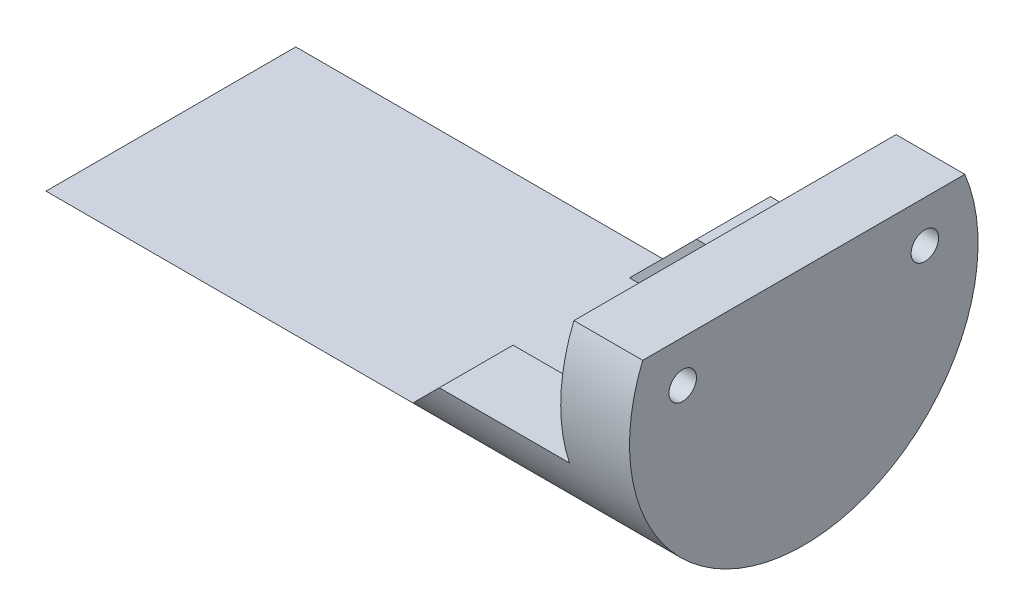
ISO-10303-21;
HEADER;
FILE_DESCRIPTION(('STEP AP214'),'2;1');
FILE_NAME('part.step','',(''),(''),'','','');
FILE_SCHEMA(('AUTOMOTIVE_DESIGN { 1 0 10303 214 1 1 1 1 }'));
ENDSEC;
DATA;
#1=APPLICATION_CONTEXT('core data for automotive mechanical design processes');
#2=APPLICATION_PROTOCOL_DEFINITION('international standard','automotive_design',2000,#1);
#3=PRODUCT_CONTEXT('',#1,'mechanical');
#4=PRODUCT('Part','Part','',(#3));
#5=PRODUCT_RELATED_PRODUCT_CATEGORY('part','',(#4));
#6=PRODUCT_DEFINITION_FORMATION('','',#4);
#7=PRODUCT_DEFINITION_CONTEXT('part definition',#1,'design');
#8=PRODUCT_DEFINITION('design','',#6,#7);
#9=PRODUCT_DEFINITION_SHAPE('','',#8);
#10=(LENGTH_UNIT() NAMED_UNIT(*) SI_UNIT(.MILLI.,.METRE.));
#11=(NAMED_UNIT(*) PLANE_ANGLE_UNIT() SI_UNIT($,.RADIAN.));
#12=(NAMED_UNIT(*) SI_UNIT($,.STERADIAN.) SOLID_ANGLE_UNIT());
#13=UNCERTAINTY_MEASURE_WITH_UNIT(LENGTH_MEASURE(1.E-05),#10,'distance_accuracy_value','');
#14=(GEOMETRIC_REPRESENTATION_CONTEXT(3) GLOBAL_UNCERTAINTY_ASSIGNED_CONTEXT((#13)) GLOBAL_UNIT_ASSIGNED_CONTEXT((#10,
#11,#12)) REPRESENTATION_CONTEXT('',''));
#15=CARTESIAN_POINT('',(0.,0.,0.));
#16=DIRECTION('',(0.,0.,1.));
#17=DIRECTION('',(1.,0.,0.));
#18=AXIS2_PLACEMENT_3D('',#15,#16,#17);
#19=CARTESIAN_POINT('',(0.,2.7,-13.2));
#20=DIRECTION('',(1.,0.,0.));
#21=DIRECTION('',(0.,0.,-1.));
#22=AXIS2_PLACEMENT_3D('',#19,#20,#21);
#23=CYLINDRICAL_SURFACE('',#22,0.75);
#24=CARTESIAN_POINT('',(61.5,2.7,-13.2));
#25=DIRECTION('',(1.,0.,0.));
#26=DIRECTION('',(0.,0.,-1.));
#27=AXIS2_PLACEMENT_3D('',#24,#25,#26);
#28=CIRCLE('',#27,0.75);
#29=CARTESIAN_POINT('',(61.5,2.7,-13.95));
#30=VERTEX_POINT('',#29);
#31=EDGE_CURVE('E232',#30,#30,#28,.T.);
#32=ORIENTED_EDGE('',*,*,#31,.F.);
#33=EDGE_LOOP('',(#32));
#34=FACE_BOUND('',#33,.T.);
#35=CARTESIAN_POINT('',(62.5,2.7,-13.2));
#36=DIRECTION('',(1.,0.,0.));
#37=DIRECTION('',(0.,0.,-1.));
#38=AXIS2_PLACEMENT_3D('',#35,#36,#37);
#39=CIRCLE('',#38,0.75);
#40=CARTESIAN_POINT('',(62.5,2.7,-13.95));
#41=VERTEX_POINT('',#40);
#42=EDGE_CURVE('E42',#41,#41,#39,.F.);
#43=ORIENTED_EDGE('',*,*,#42,.F.);
#44=EDGE_LOOP('',(#43));
#45=FACE_BOUND('',#44,.T.);
#46=ADVANCED_FACE('F38',(#34,#45),#23,.F.);
#47=CARTESIAN_POINT('',(0.,2.7,13.2));
#48=DIRECTION('',(1.,0.,0.));
#49=DIRECTION('',(0.,0.,-1.));
#50=AXIS2_PLACEMENT_3D('',#47,#48,#49);
#51=CYLINDRICAL_SURFACE('',#50,0.75);
#52=CARTESIAN_POINT('',(61.5,2.7,13.2));
#53=DIRECTION('',(1.,0.,0.));
#54=DIRECTION('',(0.,0.,-1.));
#55=AXIS2_PLACEMENT_3D('',#52,#53,#54);
#56=CIRCLE('',#55,0.75);
#57=CARTESIAN_POINT('',(61.5,2.7,12.45));
#58=VERTEX_POINT('',#57);
#59=EDGE_CURVE('E163',#58,#58,#56,.T.);
#60=ORIENTED_EDGE('',*,*,#59,.F.);
#61=EDGE_LOOP('',(#60));
#62=FACE_BOUND('',#61,.T.);
#63=CARTESIAN_POINT('',(62.5,2.7,13.2));
#64=DIRECTION('',(1.,0.,0.));
#65=DIRECTION('',(0.,0.,-1.));
#66=AXIS2_PLACEMENT_3D('',#63,#64,#65);
#67=CIRCLE('',#66,0.75);
#68=CARTESIAN_POINT('',(62.5,2.7,12.45));
#69=VERTEX_POINT('',#68);
#70=EDGE_CURVE('E226',#69,#69,#67,.F.);
#71=ORIENTED_EDGE('',*,*,#70,.F.);
#72=EDGE_LOOP('',(#71));
#73=FACE_BOUND('',#72,.T.);
#74=ADVANCED_FACE('F254',(#62,#73),#51,.F.);
#75=CARTESIAN_POINT('',(61.5,7.25000000000004,-19.));
#76=DIRECTION('',(1.,0.,0.));
#77=DIRECTION('',(0.,0.,-1.));
#78=AXIS2_PLACEMENT_3D('',#75,#76,#77);
#79=PLANE('',#78);
#80=ORIENTED_EDGE('',*,*,#59,.T.);
#81=EDGE_LOOP('',(#80));
#82=FACE_BOUND('',#81,.T.);
#83=ORIENTED_EDGE('',*,*,#31,.T.);
#84=EDGE_LOOP('',(#83));
#85=FACE_BOUND('',#84,.T.);
#86=DIRECTION('',(0.,1.,0.));
#87=VECTOR('',#86,1.);
#88=CARTESIAN_POINT('',(61.5,-13.2500000000001,-10.));
#89=LINE('',#88,#87);
#90=CARTESIAN_POINT('',(61.5,-5.94469584126148,-10.));
#91=VERTEX_POINT('',#90);
#92=CARTESIAN_POINT('',(61.5,5.78142433836487,-10.));
#93=VERTEX_POINT('',#92);
#94=EDGE_CURVE('E157',#91,#93,#89,.T.);
#95=ORIENTED_EDGE('',*,*,#94,.T.);
#96=DIRECTION('',(0.,0.,1.));
#97=VECTOR('',#96,1.);
#98=CARTESIAN_POINT('',(61.5,5.78142433836487,-10.));
#99=LINE('',#98,#97);
#100=CARTESIAN_POINT('',(61.5,5.78142433836487,10.));
#101=VERTEX_POINT('',#100);
#102=EDGE_CURVE('E160',#93,#101,#99,.T.);
#103=ORIENTED_EDGE('',*,*,#102,.T.);
#104=DIRECTION('',(0.,1.,0.));
#105=VECTOR('',#104,1.);
#106=CARTESIAN_POINT('',(61.5,-13.2500000000001,10.));
#107=LINE('',#106,#105);
#108=CARTESIAN_POINT('',(61.5,-5.94469584126147,10.));
#109=VERTEX_POINT('',#108);
#110=EDGE_CURVE('E168',#109,#101,#107,.T.);
#111=ORIENTED_EDGE('',*,*,#110,.F.);
#112=DIRECTION('',(0.,0.,1.));
#113=VECTOR('',#112,1.);
#114=CARTESIAN_POINT('',(61.5,-5.94469584126148,-19.));
#115=LINE('',#114,#113);
#116=CARTESIAN_POINT('',(61.5,-5.94469584126148,18.046068584456));
#117=VERTEX_POINT('',#116);
#118=EDGE_CURVE('E189',#109,#117,#115,.T.);
#119=ORIENTED_EDGE('',*,*,#118,.T.);
#120=CARTESIAN_POINT('',(61.5,0.,0.));
#121=DIRECTION('',(1.,0.,0.));
#122=DIRECTION('',(0.,0.,-1.));
#123=AXIS2_PLACEMENT_3D('',#120,#121,#122);
#124=CIRCLE('',#123,19.);
#125=CARTESIAN_POINT('',(61.5,7.25000000000004,17.5623887896835));
#126=VERTEX_POINT('',#125);
#127=EDGE_CURVE('E217',#126,#117,#124,.T.);
#128=ORIENTED_EDGE('',*,*,#127,.F.);
#129=DIRECTION('',(0.,0.,1.));
#130=VECTOR('',#129,1.);
#131=CARTESIAN_POINT('',(61.5,7.25000000000004,-19.));
#132=LINE('',#131,#130);
#133=CARTESIAN_POINT('',(61.5,7.25000000000004,-17.5623887896835));
#134=VERTEX_POINT('',#133);
#135=EDGE_CURVE('E182',#134,#126,#132,.T.);
#136=ORIENTED_EDGE('',*,*,#135,.F.);
#137=CARTESIAN_POINT('',(61.5,-5.94469584126148,-18.046068584456));
#138=VERTEX_POINT('',#137);
#139=EDGE_CURVE('E221',#138,#134,#124,.T.);
#140=ORIENTED_EDGE('',*,*,#139,.F.);
#141=EDGE_CURVE('E186',#138,#91,#115,.T.);
#142=ORIENTED_EDGE('',*,*,#141,.T.);
#143=EDGE_LOOP('',(#95,#103,#111,#119,#128,#136,#140,#142));
#144=FACE_BOUND('',#143,.T.);
#145=ADVANCED_FACE('F252',(#82,#85,#144),#79,.F.);
#146=CARTESIAN_POINT('',(61.5,-5.94469584126148,-19.));
#147=DIRECTION('',(0.,-1.,0.));
#148=DIRECTION('',(0.,0.,-1.));
#149=AXIS2_PLACEMENT_3D('',#146,#147,#148);
#150=PLANE('',#149);
#151=DIRECTION('',(1.,0.,0.));
#152=VECTOR('',#151,1.);
#153=CARTESIAN_POINT('',(61.5,-5.94469584126148,10.));
#154=LINE('',#153,#152);
#155=CARTESIAN_POINT('',(47.3053041587385,-5.94469584126148,10.));
#156=VERTEX_POINT('',#155);
#157=EDGE_CURVE('E180',#156,#109,#154,.T.);
#158=ORIENTED_EDGE('',*,*,#157,.F.);
#159=DIRECTION('',(0.,0.,1.));
#160=VECTOR('',#159,1.);
#161=CARTESIAN_POINT('',(47.3053041587385,-5.94469584126148,-19.));
#162=LINE('',#161,#160);
#163=CARTESIAN_POINT('',(47.3053041587385,-5.94469584126148,18.046068584456));
#164=VERTEX_POINT('',#163);
#165=EDGE_CURVE('E193',#156,#164,#162,.T.);
#166=ORIENTED_EDGE('',*,*,#165,.T.);
#167=DIRECTION('',(-1.,0.,0.));
#168=VECTOR('',#167,1.);
#169=CARTESIAN_POINT('',(69.,-5.94469584126148,18.046068584456));
#170=LINE('',#169,#168);
#171=EDGE_CURVE('E220',#117,#164,#170,.T.);
#172=ORIENTED_EDGE('',*,*,#171,.F.);
#173=ORIENTED_EDGE('',*,*,#118,.F.);
#174=EDGE_LOOP('',(#158,#166,#172,#173));
#175=FACE_BOUND('',#174,.T.);
#176=ADVANCED_FACE('F262',(#175),#150,.F.);
#177=DIRECTION('',(-1.,0.,0.));
#178=VECTOR('',#177,1.);
#179=CARTESIAN_POINT('',(61.5,-5.94469584126148,-10.));
#180=LINE('',#179,#178);
#181=CARTESIAN_POINT('',(47.3053041587385,-5.94469584126148,-10.));
#182=VERTEX_POINT('',#181);
#183=EDGE_CURVE('E56',#91,#182,#180,.T.);
#184=ORIENTED_EDGE('',*,*,#183,.F.);
#185=ORIENTED_EDGE('',*,*,#141,.F.);
#186=DIRECTION('',(-1.,0.,0.));
#187=VECTOR('',#186,1.);
#188=CARTESIAN_POINT('',(69.,-5.94469584126148,-18.046068584456));
#189=LINE('',#188,#187);
#190=CARTESIAN_POINT('',(47.3053041587385,-5.94469584126148,-18.046068584456));
#191=VERTEX_POINT('',#190);
#192=EDGE_CURVE('E47',#191,#138,#189,.F.);
#193=ORIENTED_EDGE('',*,*,#192,.F.);
#194=EDGE_CURVE('E190',#191,#182,#162,.T.);
#195=ORIENTED_EDGE('',*,*,#194,.T.);
#196=EDGE_LOOP('',(#184,#185,#193,#195));
#197=FACE_BOUND('',#196,.T.);
#198=ADVANCED_FACE('F289',(#197),#150,.F.);
#199=CARTESIAN_POINT('',(47.3053041587385,-5.94469584126148,-19.));
#200=DIRECTION('',(0.70710678118655,-0.707106781186545,0.));
#201=DIRECTION('',(0.707106781186545,0.70710678118655,0.));
#202=AXIS2_PLACEMENT_3D('',#199,#200,#201);
#203=PLANE('',#202);
#204=DIRECTION('',(0.707106781186545,0.70710678118655,0.));
#205=VECTOR('',#204,1.);
#206=CARTESIAN_POINT('',(47.3053041587385,-5.94469584126147,10.));
#207=LINE('',#206,#205);
#208=CARTESIAN_POINT('',(40.,-13.2500000000001,10.));
#209=VERTEX_POINT('',#208);
#210=EDGE_CURVE('E178',#209,#156,#207,.T.);
#211=ORIENTED_EDGE('',*,*,#210,.F.);
#212=DIRECTION('',(0.,0.,1.));
#213=VECTOR('',#212,1.);
#214=CARTESIAN_POINT('',(40.,-13.25,-19.));
#215=LINE('',#214,#213);
#216=CARTESIAN_POINT('',(40.,-13.25,13.6175438313963));
#217=VERTEX_POINT('',#216);
#218=EDGE_CURVE('E137',#209,#217,#215,.T.);
#219=ORIENTED_EDGE('',*,*,#218,.T.);
#220=CARTESIAN_POINT('',(53.25,0.,0.));
#221=DIRECTION('',(0.70710678118655,-0.707106781186545,0.));
#222=DIRECTION('',(-0.707106781186545,-0.70710678118655,0.));
#223=AXIS2_PLACEMENT_3D('',#220,#221,#222);
#224=ELLIPSE('',#223,26.8700576850887,19.);
#225=EDGE_CURVE('E49',#164,#217,#224,.T.);
#226=ORIENTED_EDGE('',*,*,#225,.F.);
#227=ORIENTED_EDGE('',*,*,#165,.F.);
#228=EDGE_LOOP('',(#211,#219,#226,#227));
#229=FACE_BOUND('',#228,.T.);
#230=ADVANCED_FACE('F291',(#229),#203,.F.);
#231=DIRECTION('',(-0.707106781186545,-0.70710678118655,0.));
#232=VECTOR('',#231,1.);
#233=CARTESIAN_POINT('',(47.3053041587385,-5.94469584126148,-10.));
#234=LINE('',#233,#232);
#235=CARTESIAN_POINT('',(40.,-13.2500000000001,-10.));
#236=VERTEX_POINT('',#235);
#237=EDGE_CURVE('E140',#182,#236,#234,.T.);
#238=ORIENTED_EDGE('',*,*,#237,.F.);
#239=ORIENTED_EDGE('',*,*,#194,.F.);
#240=CARTESIAN_POINT('',(40.,-13.25,-13.6175438313963));
#241=VERTEX_POINT('',#240);
#242=EDGE_CURVE('E12',#241,#191,#224,.T.);
#243=ORIENTED_EDGE('',*,*,#242,.F.);
#244=EDGE_CURVE('E194',#241,#236,#215,.T.);
#245=ORIENTED_EDGE('',*,*,#244,.T.);
#246=EDGE_LOOP('',(#238,#239,#243,#245));
#247=FACE_BOUND('',#246,.T.);
#248=ADVANCED_FACE('F294',(#247),#203,.F.);
#249=CARTESIAN_POINT('',(69.,0.,0.));
#250=DIRECTION('',(-1.,0.,0.));
#251=DIRECTION('',(0.,0.,1.));
#252=AXIS2_PLACEMENT_3D('',#249,#250,#251);
#253=CYLINDRICAL_SURFACE('',#252,19.);
#254=ORIENTED_EDGE('',*,*,#139,.T.);
#255=DIRECTION('',(-1.,0.,0.));
#256=VECTOR('',#255,1.);
#257=CARTESIAN_POINT('',(69.,7.25000000000004,-17.5623887896835));
#258=LINE('',#257,#256);
#259=CARTESIAN_POINT('',(69.,7.25000000000004,-17.5623887896835));
#260=VERTEX_POINT('',#259);
#261=EDGE_CURVE('E202',#134,#260,#258,.F.);
#262=ORIENTED_EDGE('',*,*,#261,.T.);
#263=CARTESIAN_POINT('',(69.,0.,0.));
#264=DIRECTION('',(1.,0.,0.));
#265=DIRECTION('',(0.,0.,-1.));
#266=AXIS2_PLACEMENT_3D('',#263,#264,#265);
#267=CIRCLE('',#266,19.);
#268=CARTESIAN_POINT('',(69.,7.25000000000004,17.5623887896835));
#269=VERTEX_POINT('',#268);
#270=EDGE_CURVE('E209',#269,#260,#267,.T.);
#271=ORIENTED_EDGE('',*,*,#270,.F.);
#272=DIRECTION('',(-1.,0.,0.));
#273=VECTOR('',#272,1.);
#274=CARTESIAN_POINT('',(69.,7.25000000000004,17.5623887896835));
#275=LINE('',#274,#273);
#276=EDGE_CURVE('E205',#269,#126,#275,.T.);
#277=ORIENTED_EDGE('',*,*,#276,.T.);
#278=ORIENTED_EDGE('',*,*,#127,.T.);
#279=ORIENTED_EDGE('',*,*,#171,.T.);
#280=ORIENTED_EDGE('',*,*,#225,.T.);
#281=DIRECTION('',(-1.,0.,0.));
#282=VECTOR('',#281,1.);
#283=CARTESIAN_POINT('',(69.,-13.25,13.6175438313963));
#284=LINE('',#283,#282);
#285=CARTESIAN_POINT('',(0.,-13.25,13.6175438313963));
#286=VERTEX_POINT('',#285);
#287=EDGE_CURVE('E199',#217,#286,#284,.T.);
#288=ORIENTED_EDGE('',*,*,#287,.T.);
#289=CARTESIAN_POINT('',(0.,0.,0.));
#290=DIRECTION('',(1.,0.,0.));
#291=DIRECTION('',(0.,0.,-1.));
#292=AXIS2_PLACEMENT_3D('',#289,#290,#291);
#293=CIRCLE('',#292,19.);
#294=CARTESIAN_POINT('',(0.,-13.25,-13.6175438313963));
#295=VERTEX_POINT('',#294);
#296=EDGE_CURVE('E208',#286,#295,#293,.T.);
#297=ORIENTED_EDGE('',*,*,#296,.T.);
#298=DIRECTION('',(-1.,0.,0.));
#299=VECTOR('',#298,1.);
#300=CARTESIAN_POINT('',(69.,-13.25,-13.6175438313963));
#301=LINE('',#300,#299);
#302=EDGE_CURVE('E185',#295,#241,#301,.F.);
#303=ORIENTED_EDGE('',*,*,#302,.T.);
#304=ORIENTED_EDGE('',*,*,#242,.T.);
#305=ORIENTED_EDGE('',*,*,#192,.T.);
#306=EDGE_LOOP('',(#254,#262,#271,#277,#278,#279,#280,#288,#297,#303,#304,#305));
#307=FACE_BOUND('',#306,.T.);
#308=ADVANCED_FACE('F40',(#307),#253,.T.);
#309=CARTESIAN_POINT('',(69.,0.,0.));
#310=DIRECTION('',(1.,0.,0.));
#311=DIRECTION('',(0.,0.,-1.));
#312=AXIS2_PLACEMENT_3D('',#309,#310,#311);
#313=PLANE('',#312);
#314=CARTESIAN_POINT('',(69.,2.7,13.2));
#315=DIRECTION('',(1.,0.,0.));
#316=DIRECTION('',(0.,0.,-1.));
#317=AXIS2_PLACEMENT_3D('',#314,#315,#316);
#318=CIRCLE('',#317,1.5);
#319=CARTESIAN_POINT('',(69.,2.7,11.7));
#320=VERTEX_POINT('',#319);
#321=EDGE_CURVE('E234',#320,#320,#318,.T.);
#322=ORIENTED_EDGE('',*,*,#321,.F.);
#323=EDGE_LOOP('',(#322));
#324=FACE_BOUND('',#323,.T.);
#325=CARTESIAN_POINT('',(69.,2.7,-13.2));
#326=DIRECTION('',(1.,0.,0.));
#327=DIRECTION('',(0.,0.,-1.));
#328=AXIS2_PLACEMENT_3D('',#325,#326,#327);
#329=CIRCLE('',#328,1.5);
#330=CARTESIAN_POINT('',(69.,2.7,-14.7));
#331=VERTEX_POINT('',#330);
#332=EDGE_CURVE('E242',#331,#331,#329,.T.);
#333=ORIENTED_EDGE('',*,*,#332,.F.);
#334=EDGE_LOOP('',(#333));
#335=FACE_BOUND('',#334,.T.);
#336=DIRECTION('',(0.,0.,-1.));
#337=VECTOR('',#336,1.);
#338=CARTESIAN_POINT('',(69.,7.25000000000004,0.));
#339=LINE('',#338,#337);
#340=EDGE_CURVE('E215',#269,#260,#339,.T.);
#341=ORIENTED_EDGE('',*,*,#340,.F.);
#342=ORIENTED_EDGE('',*,*,#270,.T.);
#343=EDGE_LOOP('',(#341,#342));
#344=FACE_BOUND('',#343,.T.);
#345=ADVANCED_FACE('F298',(#324,#335,#344),#313,.T.);
#346=CARTESIAN_POINT('',(0.,0.,0.));
#347=DIRECTION('',(1.,0.,0.));
#348=DIRECTION('',(0.,0.,-1.));
#349=AXIS2_PLACEMENT_3D('',#346,#347,#348);
#350=PLANE('',#349);
#351=ORIENTED_EDGE('',*,*,#296,.F.);
#352=DIRECTION('',(0.,0.,-1.));
#353=VECTOR('',#352,1.);
#354=CARTESIAN_POINT('',(0.,-13.25,0.));
#355=LINE('',#354,#353);
#356=EDGE_CURVE('E63',#286,#295,#355,.T.);
#357=ORIENTED_EDGE('',*,*,#356,.T.);
#358=EDGE_LOOP('',(#351,#357));
#359=FACE_BOUND('',#358,.T.);
#360=ADVANCED_FACE('F284',(#359),#350,.F.);
#361=CARTESIAN_POINT('',(69.,7.25000000000004,-19.));
#362=DIRECTION('',(0.,-1.,0.));
#363=DIRECTION('',(1.,0.,0.));
#364=AXIS2_PLACEMENT_3D('',#361,#362,#363);
#365=PLANE('',#364);
#366=ORIENTED_EDGE('',*,*,#340,.T.);
#367=ORIENTED_EDGE('',*,*,#261,.F.);
#368=ORIENTED_EDGE('',*,*,#135,.T.);
#369=ORIENTED_EDGE('',*,*,#276,.F.);
#370=EDGE_LOOP('',(#366,#367,#368,#369));
#371=FACE_BOUND('',#370,.T.);
#372=ADVANCED_FACE('F282',(#371),#365,.F.);
#373=CARTESIAN_POINT('',(40.,-13.25,-19.));
#374=DIRECTION('',(0.,-1.,0.));
#375=DIRECTION('',(1.,0.,0.));
#376=AXIS2_PLACEMENT_3D('',#373,#374,#375);
#377=PLANE('',#376);
#378=ORIENTED_EDGE('',*,*,#302,.F.);
#379=ORIENTED_EDGE('',*,*,#356,.F.);
#380=ORIENTED_EDGE('',*,*,#287,.F.);
#381=ORIENTED_EDGE('',*,*,#218,.F.);
#382=DIRECTION('',(1.,0.,0.));
#383=VECTOR('',#382,1.);
#384=CARTESIAN_POINT('',(0.,-13.2500000000001,10.));
#385=LINE('',#384,#383);
#386=CARTESIAN_POINT('',(67.5,-13.2500000000001,10.));
#387=VERTEX_POINT('',#386);
#388=EDGE_CURVE('E130',#209,#387,#385,.T.);
#389=ORIENTED_EDGE('',*,*,#388,.T.);
#390=DIRECTION('',(0.,0.,1.));
#391=VECTOR('',#390,1.);
#392=CARTESIAN_POINT('',(67.5,-13.2500000000001,-10.));
#393=LINE('',#392,#391);
#394=CARTESIAN_POINT('',(67.5,-13.2500000000001,-10.));
#395=VERTEX_POINT('',#394);
#396=EDGE_CURVE('E135',#395,#387,#393,.T.);
#397=ORIENTED_EDGE('',*,*,#396,.F.);
#398=DIRECTION('',(1.,0.,0.));
#399=VECTOR('',#398,1.);
#400=CARTESIAN_POINT('',(0.,-13.2500000000001,-10.));
#401=LINE('',#400,#399);
#402=EDGE_CURVE('E141',#236,#395,#401,.T.);
#403=ORIENTED_EDGE('',*,*,#402,.F.);
#404=ORIENTED_EDGE('',*,*,#244,.F.);
#405=EDGE_LOOP('',(#378,#379,#380,#381,#389,#397,#403,#404));
#406=FACE_BOUND('',#405,.T.);
#407=ADVANCED_FACE('F132',(#406),#377,.F.);
#408=CARTESIAN_POINT('',(0.,0.749999999999946,10.));
#409=DIRECTION('',(0.,0.,-1.));
#410=DIRECTION('',(0.,1.,0.));
#411=AXIS2_PLACEMENT_3D('',#408,#409,#410);
#412=PLANE('',#411);
#413=ORIENTED_EDGE('',*,*,#157,.T.);
#414=ORIENTED_EDGE('',*,*,#110,.T.);
#415=DIRECTION('',(-1.,0.,0.));
#416=VECTOR('',#415,1.);
#417=CARTESIAN_POINT('',(67.5,5.78142433836487,10.));
#418=LINE('',#417,#416);
#419=CARTESIAN_POINT('',(67.5,5.78142433836487,10.));
#420=VERTEX_POINT('',#419);
#421=EDGE_CURVE('E149',#420,#101,#418,.T.);
#422=ORIENTED_EDGE('',*,*,#421,.F.);
#423=DIRECTION('',(0.,1.,0.));
#424=VECTOR('',#423,1.);
#425=CARTESIAN_POINT('',(67.5,-13.2500000000001,10.));
#426=LINE('',#425,#424);
#427=EDGE_CURVE('E145',#387,#420,#426,.T.);
#428=ORIENTED_EDGE('',*,*,#427,.F.);
#429=ORIENTED_EDGE('',*,*,#388,.F.);
#430=ORIENTED_EDGE('',*,*,#210,.T.);
#431=EDGE_LOOP('',(#413,#414,#422,#428,#429,#430));
#432=FACE_BOUND('',#431,.T.);
#433=ADVANCED_FACE('F147',(#432),#412,.T.);
#434=CARTESIAN_POINT('',(0.,-13.2500000000001,-10.));
#435=DIRECTION('',(0.,0.,1.));
#436=DIRECTION('',(1.,0.,0.));
#437=AXIS2_PLACEMENT_3D('',#434,#435,#436);
#438=PLANE('',#437);
#439=ORIENTED_EDGE('',*,*,#183,.T.);
#440=ORIENTED_EDGE('',*,*,#237,.T.);
#441=ORIENTED_EDGE('',*,*,#402,.T.);
#442=DIRECTION('',(0.,1.,0.));
#443=VECTOR('',#442,1.);
#444=CARTESIAN_POINT('',(67.5,-13.2500000000001,-10.));
#445=LINE('',#444,#443);
#446=CARTESIAN_POINT('',(67.5,5.78142433836487,-10.));
#447=VERTEX_POINT('',#446);
#448=EDGE_CURVE('E156',#395,#447,#445,.T.);
#449=ORIENTED_EDGE('',*,*,#448,.T.);
#450=DIRECTION('',(-1.,0.,0.));
#451=VECTOR('',#450,1.);
#452=CARTESIAN_POINT('',(67.5,5.78142433836487,-10.));
#453=LINE('',#452,#451);
#454=EDGE_CURVE('E172',#447,#93,#453,.T.);
#455=ORIENTED_EDGE('',*,*,#454,.T.);
#456=ORIENTED_EDGE('',*,*,#94,.F.);
#457=EDGE_LOOP('',(#439,#440,#441,#449,#455,#456));
#458=FACE_BOUND('',#457,.T.);
#459=ADVANCED_FACE('F276',(#458),#438,.T.);
#460=CARTESIAN_POINT('',(67.5,5.78142433836487,-10.));
#461=DIRECTION('',(0.,-1.,0.));
#462=DIRECTION('',(0.,0.,-1.));
#463=AXIS2_PLACEMENT_3D('',#460,#461,#462);
#464=PLANE('',#463);
#465=ORIENTED_EDGE('',*,*,#102,.F.);
#466=ORIENTED_EDGE('',*,*,#454,.F.);
#467=DIRECTION('',(0.,0.,1.));
#468=VECTOR('',#467,1.);
#469=CARTESIAN_POINT('',(67.5,5.78142433836487,-10.));
#470=LINE('',#469,#468);
#471=EDGE_CURVE('E152',#447,#420,#470,.T.);
#472=ORIENTED_EDGE('',*,*,#471,.T.);
#473=ORIENTED_EDGE('',*,*,#421,.T.);
#474=EDGE_LOOP('',(#465,#466,#472,#473));
#475=FACE_BOUND('',#474,.T.);
#476=ADVANCED_FACE('F273',(#475),#464,.T.);
#477=CARTESIAN_POINT('',(67.5,0.,0.));
#478=DIRECTION('',(-1.,0.,0.));
#479=DIRECTION('',(0.,0.,1.));
#480=AXIS2_PLACEMENT_3D('',#477,#478,#479);
#481=PLANE('',#480);
#482=ORIENTED_EDGE('',*,*,#396,.T.);
#483=ORIENTED_EDGE('',*,*,#427,.T.);
#484=ORIENTED_EDGE('',*,*,#471,.F.);
#485=ORIENTED_EDGE('',*,*,#448,.F.);
#486=EDGE_LOOP('',(#482,#483,#484,#485));
#487=FACE_BOUND('',#486,.T.);
#488=ADVANCED_FACE('F155',(#487),#481,.T.);
#489=CARTESIAN_POINT('',(62.5,7.25000000000004,-19.));
#490=DIRECTION('',(1.,0.,0.));
#491=DIRECTION('',(0.,0.,-1.));
#492=AXIS2_PLACEMENT_3D('',#489,#490,#491);
#493=PLANE('',#492);
#494=CARTESIAN_POINT('',(62.5,2.7,13.2));
#495=DIRECTION('',(1.,0.,0.));
#496=DIRECTION('',(0.,0.,-1.));
#497=AXIS2_PLACEMENT_3D('',#494,#495,#496);
#498=CIRCLE('',#497,1.5);
#499=CARTESIAN_POINT('',(62.5,2.7,11.7));
#500=VERTEX_POINT('',#499);
#501=EDGE_CURVE('E228',#500,#500,#498,.F.);
#502=ORIENTED_EDGE('',*,*,#501,.F.);
#503=EDGE_LOOP('',(#502));
#504=FACE_BOUND('',#503,.T.);
#505=ORIENTED_EDGE('',*,*,#70,.T.);
#506=EDGE_LOOP('',(#505));
#507=FACE_BOUND('',#506,.T.);
#508=ADVANCED_FACE('F272',(#504,#507),#493,.T.);
#509=CARTESIAN_POINT('',(57.2573593128808,2.7,13.2));
#510=DIRECTION('',(1.,0.,0.));
#511=DIRECTION('',(0.,0.,-1.));
#512=AXIS2_PLACEMENT_3D('',#509,#510,#511);
#513=CYLINDRICAL_SURFACE('',#512,1.5);
#514=CARTESIAN_POINT('',(62.5,2.7,11.7));
#515=CARTESIAN_POINT('',(62.5677083333334,2.7,11.7));
#516=CARTESIAN_POINT('',(62.6354166666667,2.7,11.7));
#517=CARTESIAN_POINT('',(62.7708333333334,2.7,11.7));
#518=CARTESIAN_POINT('',(62.8385416666667,2.7,11.7));
#519=CARTESIAN_POINT('',(62.9739583333334,2.7,11.7));
#520=CARTESIAN_POINT('',(63.0416666666667,2.7,11.7));
#521=CARTESIAN_POINT('',(63.1770833333334,2.7,11.7));
#522=CARTESIAN_POINT('',(63.2447916666667,2.7,11.7));
#523=CARTESIAN_POINT('',(63.3802083333334,2.7,11.7));
#524=CARTESIAN_POINT('',(63.4479166666667,2.7,11.7));
#525=CARTESIAN_POINT('',(63.5833333333334,2.7,11.7));
#526=CARTESIAN_POINT('',(63.6510416666667,2.7,11.7));
#527=CARTESIAN_POINT('',(63.7864583333334,2.7,11.7));
#528=CARTESIAN_POINT('',(63.8541666666667,2.7,11.7));
#529=CARTESIAN_POINT('',(63.9895833333334,2.7,11.7));
#530=CARTESIAN_POINT('',(64.0572916666667,2.7,11.7));
#531=CARTESIAN_POINT('',(64.1927083333334,2.7,11.7));
#532=CARTESIAN_POINT('',(64.2604166666667,2.7,11.7));
#533=CARTESIAN_POINT('',(64.3958333333334,2.7,11.7));
#534=CARTESIAN_POINT('',(64.4635416666667,2.7,11.7));
#535=CARTESIAN_POINT('',(64.5989583333334,2.7,11.7));
#536=CARTESIAN_POINT('',(64.6666666666667,2.7,11.7));
#537=CARTESIAN_POINT('',(64.8020833333334,2.7,11.7));
#538=CARTESIAN_POINT('',(64.8697916666667,2.7,11.7));
#539=CARTESIAN_POINT('',(65.0052083333334,2.7,11.7));
#540=CARTESIAN_POINT('',(65.0729166666667,2.7,11.7));
#541=CARTESIAN_POINT('',(65.2083333333334,2.7,11.7));
#542=CARTESIAN_POINT('',(65.2760416666667,2.7,11.7));
#543=CARTESIAN_POINT('',(65.4114583333334,2.7,11.7));
#544=CARTESIAN_POINT('',(65.4791666666667,2.7,11.7));
#545=CARTESIAN_POINT('',(65.6145833333334,2.7,11.7));
#546=CARTESIAN_POINT('',(65.6822916666667,2.7,11.7));
#547=CARTESIAN_POINT('',(65.8177083333333,2.7,11.7));
#548=CARTESIAN_POINT('',(65.8854166666667,2.7,11.7));
#549=CARTESIAN_POINT('',(66.0208333333333,2.7,11.7));
#550=CARTESIAN_POINT('',(66.0885416666667,2.7,11.7));
#551=CARTESIAN_POINT('',(66.2239583333333,2.7,11.7));
#552=CARTESIAN_POINT('',(66.2916666666667,2.7,11.7));
#553=CARTESIAN_POINT('',(66.4270833333333,2.7,11.7));
#554=CARTESIAN_POINT('',(66.4947916666667,2.7,11.7));
#555=CARTESIAN_POINT('',(66.6302083333333,2.7,11.7));
#556=CARTESIAN_POINT('',(66.6979166666667,2.7,11.7));
#557=CARTESIAN_POINT('',(66.8333333333333,2.7,11.7));
#558=CARTESIAN_POINT('',(66.9010416666667,2.7,11.7));
#559=CARTESIAN_POINT('',(67.0364583333333,2.7,11.7));
#560=CARTESIAN_POINT('',(67.1041666666667,2.7,11.7));
#561=CARTESIAN_POINT('',(67.2395833333333,2.7,11.7));
#562=CARTESIAN_POINT('',(67.3072916666667,2.7,11.7));
#563=CARTESIAN_POINT('',(67.4427083333333,2.7,11.7));
#564=CARTESIAN_POINT('',(67.5104166666667,2.7,11.7));
#565=CARTESIAN_POINT('',(67.6458333333333,2.7,11.7));
#566=CARTESIAN_POINT('',(67.7135416666667,2.7,11.7));
#567=CARTESIAN_POINT('',(67.8489583333333,2.7,11.7));
#568=CARTESIAN_POINT('',(67.9166666666667,2.7,11.7));
#569=CARTESIAN_POINT('',(68.0520833333333,2.7,11.7));
#570=CARTESIAN_POINT('',(68.1197916666667,2.7,11.7));
#571=CARTESIAN_POINT('',(68.2552083333333,2.7,11.7));
#572=CARTESIAN_POINT('',(68.3229166666667,2.7,11.7));
#573=CARTESIAN_POINT('',(68.4583333333333,2.7,11.7));
#574=CARTESIAN_POINT('',(68.5260416666667,2.7,11.7));
#575=CARTESIAN_POINT('',(68.6614583333333,2.7,11.7));
#576=CARTESIAN_POINT('',(68.7291666666667,2.7,11.7));
#577=CARTESIAN_POINT('',(68.8645833333333,2.7,11.7));
#578=CARTESIAN_POINT('',(68.9322916666667,2.7,11.7));
#579=CARTESIAN_POINT('',(69.,2.7,11.7));
#580=B_SPLINE_CURVE_WITH_KNOTS('',3,(#514,#515,#516,#517,#518,#519,#520,#521,#522,#523,#524,
#525,#526,#527,#528,#529,#530,#531,#532,#533,#534,#535,#536,#537,#538,#539,#540,#541,#542,#543,
#544,#545,#546,#547,#548,#549,#550,#551,#552,#553,#554,#555,#556,#557,#558,#559,#560,#561,#562,
#563,#564,#565,#566,#567,#568,#569,#570,#571,#572,#573,#574,#575,#576,#577,#578,#579),
.UNSPECIFIED.,.F.,.F.,(4,2,2,2,2,2,2,2,2,2,2,2,2,2,2,2,2,2,2,2,2,2,2,2,2,2,2,2,2,2,2,2,4),(0.,
0.203124999999998,0.406249999999997,0.609374999999995,0.812499999999994,1.01562499999999,
1.21874999999999,1.42187499999999,1.62499999999999,1.82812499999999,2.03124999999998,
2.23437499999998,2.43749999999998,2.64062499999998,2.84374999999998,3.04687499999998,
3.24999999999998,3.45312499999997,3.65624999999997,3.85937499999997,4.06249999999997,
4.26562499999997,4.46874999999997,4.67187499999996,4.87499999999996,5.07812499999996,
5.28124999999996,5.48437499999996,5.68749999999996,5.89062499999995,6.09374999999995,
6.29687499999995,6.49999999999995),.UNSPECIFIED.);
#581=EDGE_CURVE('BSEAM361',#500,#320,#580,.T.);
#582=ORIENTED_EDGE('',*,*,#501,.T.);
#583=ORIENTED_EDGE('',*,*,#321,.T.);
#584=ORIENTED_EDGE('',*,*,#581,.T.);
#585=ORIENTED_EDGE('',*,*,#581,.F.);
#586=EDGE_LOOP('',(#582,#584,#583,#585));
#587=FACE_BOUND('',#586,.T.);
#588=ADVANCED_FACE('F361',(#587),#513,.F.);
#589=CARTESIAN_POINT('',(62.5,7.25000000000004,-19.));
#590=DIRECTION('',(1.,0.,0.));
#591=DIRECTION('',(0.,0.,-1.));
#592=AXIS2_PLACEMENT_3D('',#589,#590,#591);
#593=PLANE('',#592);
#594=CARTESIAN_POINT('',(62.5,2.7,-13.2));
#595=DIRECTION('',(1.,0.,0.));
#596=DIRECTION('',(0.,0.,-1.));
#597=AXIS2_PLACEMENT_3D('',#594,#595,#596);
#598=CIRCLE('',#597,1.5);
#599=CARTESIAN_POINT('',(62.5,2.7,-14.7));
#600=VERTEX_POINT('',#599);
#601=EDGE_CURVE('E239',#600,#600,#598,.F.);
#602=ORIENTED_EDGE('',*,*,#601,.F.);
#603=EDGE_LOOP('',(#602));
#604=FACE_BOUND('',#603,.T.);
#605=ORIENTED_EDGE('',*,*,#42,.T.);
#606=EDGE_LOOP('',(#605));
#607=FACE_BOUND('',#606,.T.);
#608=ADVANCED_FACE('F372',(#604,#607),#593,.T.);
#609=CARTESIAN_POINT('',(57.2573593128808,2.7,-13.2));
#610=DIRECTION('',(1.,0.,0.));
#611=DIRECTION('',(0.,0.,-1.));
#612=AXIS2_PLACEMENT_3D('',#609,#610,#611);
#613=CYLINDRICAL_SURFACE('',#612,1.5);
#614=CARTESIAN_POINT('',(62.5,2.7,-14.7));
#615=CARTESIAN_POINT('',(62.5677083333334,2.7,-14.7));
#616=CARTESIAN_POINT('',(62.6354166666667,2.7,-14.7));
#617=CARTESIAN_POINT('',(62.7708333333334,2.7,-14.7));
#618=CARTESIAN_POINT('',(62.8385416666667,2.7,-14.7));
#619=CARTESIAN_POINT('',(62.9739583333334,2.7,-14.7));
#620=CARTESIAN_POINT('',(63.0416666666667,2.7,-14.7));
#621=CARTESIAN_POINT('',(63.1770833333334,2.7,-14.7));
#622=CARTESIAN_POINT('',(63.2447916666667,2.7,-14.7));
#623=CARTESIAN_POINT('',(63.3802083333334,2.7,-14.7));
#624=CARTESIAN_POINT('',(63.4479166666667,2.7,-14.7));
#625=CARTESIAN_POINT('',(63.5833333333334,2.7,-14.7));
#626=CARTESIAN_POINT('',(63.6510416666667,2.7,-14.7));
#627=CARTESIAN_POINT('',(63.7864583333334,2.7,-14.7));
#628=CARTESIAN_POINT('',(63.8541666666667,2.7,-14.7));
#629=CARTESIAN_POINT('',(63.9895833333334,2.7,-14.7));
#630=CARTESIAN_POINT('',(64.0572916666667,2.7,-14.7));
#631=CARTESIAN_POINT('',(64.1927083333334,2.7,-14.7));
#632=CARTESIAN_POINT('',(64.2604166666667,2.7,-14.7));
#633=CARTESIAN_POINT('',(64.3958333333334,2.7,-14.7));
#634=CARTESIAN_POINT('',(64.4635416666667,2.7,-14.7));
#635=CARTESIAN_POINT('',(64.5989583333334,2.7,-14.7));
#636=CARTESIAN_POINT('',(64.6666666666667,2.7,-14.7));
#637=CARTESIAN_POINT('',(64.8020833333334,2.7,-14.7));
#638=CARTESIAN_POINT('',(64.8697916666667,2.7,-14.7));
#639=CARTESIAN_POINT('',(65.0052083333334,2.7,-14.7));
#640=CARTESIAN_POINT('',(65.0729166666667,2.7,-14.7));
#641=CARTESIAN_POINT('',(65.2083333333334,2.7,-14.7));
#642=CARTESIAN_POINT('',(65.2760416666667,2.7,-14.7));
#643=CARTESIAN_POINT('',(65.4114583333334,2.7,-14.7));
#644=CARTESIAN_POINT('',(65.4791666666667,2.7,-14.7));
#645=CARTESIAN_POINT('',(65.6145833333334,2.7,-14.7));
#646=CARTESIAN_POINT('',(65.6822916666667,2.7,-14.7));
#647=CARTESIAN_POINT('',(65.8177083333333,2.7,-14.7));
#648=CARTESIAN_POINT('',(65.8854166666667,2.7,-14.7));
#649=CARTESIAN_POINT('',(66.0208333333333,2.7,-14.7));
#650=CARTESIAN_POINT('',(66.0885416666667,2.7,-14.7));
#651=CARTESIAN_POINT('',(66.2239583333333,2.7,-14.7));
#652=CARTESIAN_POINT('',(66.2916666666667,2.7,-14.7));
#653=CARTESIAN_POINT('',(66.4270833333333,2.7,-14.7));
#654=CARTESIAN_POINT('',(66.4947916666667,2.7,-14.7));
#655=CARTESIAN_POINT('',(66.6302083333333,2.7,-14.7));
#656=CARTESIAN_POINT('',(66.6979166666667,2.7,-14.7));
#657=CARTESIAN_POINT('',(66.8333333333333,2.7,-14.7));
#658=CARTESIAN_POINT('',(66.9010416666667,2.7,-14.7));
#659=CARTESIAN_POINT('',(67.0364583333333,2.7,-14.7));
#660=CARTESIAN_POINT('',(67.1041666666667,2.7,-14.7));
#661=CARTESIAN_POINT('',(67.2395833333333,2.7,-14.7));
#662=CARTESIAN_POINT('',(67.3072916666667,2.7,-14.7));
#663=CARTESIAN_POINT('',(67.4427083333333,2.7,-14.7));
#664=CARTESIAN_POINT('',(67.5104166666667,2.7,-14.7));
#665=CARTESIAN_POINT('',(67.6458333333333,2.7,-14.7));
#666=CARTESIAN_POINT('',(67.7135416666667,2.7,-14.7));
#667=CARTESIAN_POINT('',(67.8489583333333,2.7,-14.7));
#668=CARTESIAN_POINT('',(67.9166666666667,2.7,-14.7));
#669=CARTESIAN_POINT('',(68.0520833333333,2.7,-14.7));
#670=CARTESIAN_POINT('',(68.1197916666667,2.7,-14.7));
#671=CARTESIAN_POINT('',(68.2552083333333,2.7,-14.7));
#672=CARTESIAN_POINT('',(68.3229166666667,2.7,-14.7));
#673=CARTESIAN_POINT('',(68.4583333333333,2.7,-14.7));
#674=CARTESIAN_POINT('',(68.5260416666667,2.7,-14.7));
#675=CARTESIAN_POINT('',(68.6614583333333,2.7,-14.7));
#676=CARTESIAN_POINT('',(68.7291666666667,2.7,-14.7));
#677=CARTESIAN_POINT('',(68.8645833333333,2.7,-14.7));
#678=CARTESIAN_POINT('',(68.9322916666667,2.7,-14.7));
#679=CARTESIAN_POINT('',(69.,2.7,-14.7));
#680=B_SPLINE_CURVE_WITH_KNOTS('',3,(#614,#615,#616,#617,#618,#619,#620,#621,#622,#623,#624,
#625,#626,#627,#628,#629,#630,#631,#632,#633,#634,#635,#636,#637,#638,#639,#640,#641,#642,#643,
#644,#645,#646,#647,#648,#649,#650,#651,#652,#653,#654,#655,#656,#657,#658,#659,#660,#661,#662,
#663,#664,#665,#666,#667,#668,#669,#670,#671,#672,#673,#674,#675,#676,#677,#678,#679),
.UNSPECIFIED.,.F.,.F.,(4,2,2,2,2,2,2,2,2,2,2,2,2,2,2,2,2,2,2,2,2,2,2,2,2,2,2,2,2,2,2,2,4),(0.,
0.203124999999998,0.406249999999997,0.609374999999995,0.812499999999994,1.01562499999999,
1.21874999999999,1.42187499999999,1.62499999999999,1.82812499999999,2.03124999999998,
2.23437499999998,2.43749999999998,2.64062499999998,2.84374999999998,3.04687499999998,
3.24999999999998,3.45312499999997,3.65624999999997,3.85937499999997,4.06249999999997,
4.26562499999997,4.46874999999997,4.67187499999996,4.87499999999996,5.07812499999996,
5.28124999999996,5.48437499999996,5.68749999999996,5.89062499999995,6.09374999999995,
6.29687499999995,6.49999999999995),.UNSPECIFIED.);
#681=EDGE_CURVE('BSEAM267',#600,#331,#680,.T.);
#682=ORIENTED_EDGE('',*,*,#601,.T.);
#683=ORIENTED_EDGE('',*,*,#332,.T.);
#684=ORIENTED_EDGE('',*,*,#681,.T.);
#685=ORIENTED_EDGE('',*,*,#681,.F.);
#686=EDGE_LOOP('',(#682,#684,#683,#685));
#687=FACE_BOUND('',#686,.T.);
#688=ADVANCED_FACE('F267',(#687),#613,.F.);
#689=CLOSED_SHELL('',(#46,#74,#145,#176,#198,#230,#248,#308,#345,#360,#372,#407,#433,#459,#476,
#488,#508,#588,#608,#688));
#690=MANIFOLD_SOLID_BREP('B2',#689);
#691=ADVANCED_BREP_SHAPE_REPRESENTATION('',(#18,#690),#14);
#692=SHAPE_DEFINITION_REPRESENTATION(#9,#691);
ENDSEC;
END-ISO-10303-21;
